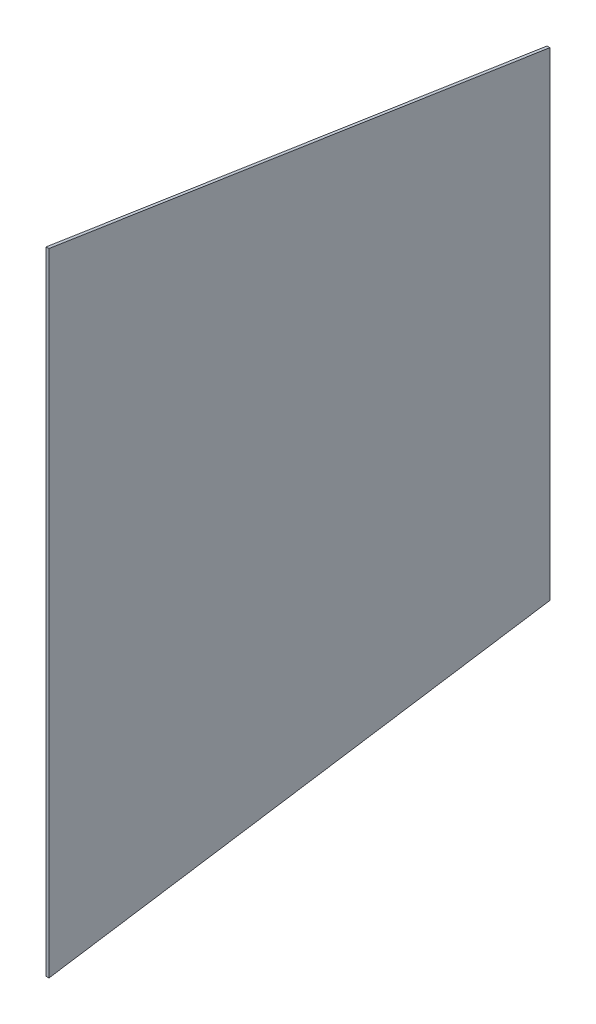
ISO-10303-21;
HEADER;
FILE_DESCRIPTION(('STEP AP214'),'2;1');
FILE_NAME('part.step','',(''),(''),'','','');
FILE_SCHEMA(('AUTOMOTIVE_DESIGN { 1 0 10303 214 1 1 1 1 }'));
ENDSEC;
DATA;
#1=APPLICATION_CONTEXT('core data for automotive mechanical design processes');
#2=APPLICATION_PROTOCOL_DEFINITION('international standard','automotive_design',2000,#1);
#3=PRODUCT_CONTEXT('',#1,'mechanical');
#4=PRODUCT('Part','Part','',(#3));
#5=PRODUCT_RELATED_PRODUCT_CATEGORY('part','',(#4));
#6=PRODUCT_DEFINITION_FORMATION('','',#4);
#7=PRODUCT_DEFINITION_CONTEXT('part definition',#1,'design');
#8=PRODUCT_DEFINITION('design','',#6,#7);
#9=PRODUCT_DEFINITION_SHAPE('','',#8);
#10=(LENGTH_UNIT() NAMED_UNIT(*) SI_UNIT(.MILLI.,.METRE.));
#11=(NAMED_UNIT(*) PLANE_ANGLE_UNIT() SI_UNIT($,.RADIAN.));
#12=(NAMED_UNIT(*) SI_UNIT($,.STERADIAN.) SOLID_ANGLE_UNIT());
#13=UNCERTAINTY_MEASURE_WITH_UNIT(LENGTH_MEASURE(1.E-05),#10,'distance_accuracy_value','');
#14=(GEOMETRIC_REPRESENTATION_CONTEXT(3) GLOBAL_UNCERTAINTY_ASSIGNED_CONTEXT((#13)) GLOBAL_UNIT_ASSIGNED_CONTEXT((#10,
#11,#12)) REPRESENTATION_CONTEXT('',''));
#15=CARTESIAN_POINT('',(0.,0.,0.));
#16=DIRECTION('',(0.,0.,1.));
#17=DIRECTION('',(1.,0.,0.));
#18=AXIS2_PLACEMENT_3D('',#15,#16,#17);
#19=CARTESIAN_POINT('',(15.875,131.986549459237,-442.9125));
#20=DIRECTION('',(0.,-0.988537017775799,0.150978688850212));
#21=DIRECTION('',(0.,-0.150978688850212,-0.988537017775799));
#22=AXIS2_PLACEMENT_3D('',#19,#20,#21);
#23=PLANE('',#22);
#24=DIRECTION('',(0.,0.150978688850212,0.988537017775799));
#25=VECTOR('',#24,1.);
#26=CARTESIAN_POINT('',(14.2875,131.986549459237,-442.9125));
#27=LINE('',#26,#25);
#28=CARTESIAN_POINT('',(14.2875,131.986549459237,-442.9125));
#29=VERTEX_POINT('',#28);
#30=CARTESIAN_POINT('',(14.2875,174.174234470248,-166.6875));
#31=VERTEX_POINT('',#30);
#32=EDGE_CURVE('E98',#29,#31,#27,.T.);
#33=ORIENTED_EDGE('',*,*,#32,.T.);
#34=DIRECTION('',(-1.,0.,0.));
#35=VECTOR('',#34,1.);
#36=CARTESIAN_POINT('',(15.875,174.174234470248,-166.6875));
#37=LINE('',#36,#35);
#38=CARTESIAN_POINT('',(15.875,174.174234470248,-166.6875));
#39=VERTEX_POINT('',#38);
#40=EDGE_CURVE('E11',#39,#31,#37,.T.);
#41=ORIENTED_EDGE('',*,*,#40,.F.);
#42=DIRECTION('',(0.,0.150978688850212,0.988537017775799));
#43=VECTOR('',#42,1.);
#44=CARTESIAN_POINT('',(15.875,131.986549459237,-442.9125));
#45=LINE('',#44,#43);
#46=CARTESIAN_POINT('',(15.875,131.986549459237,-442.9125));
#47=VERTEX_POINT('',#46);
#48=EDGE_CURVE('E86',#47,#39,#45,.T.);
#49=ORIENTED_EDGE('',*,*,#48,.F.);
#50=DIRECTION('',(-1.,0.,0.));
#51=VECTOR('',#50,1.);
#52=CARTESIAN_POINT('',(15.875,131.986549459237,-442.9125));
#53=LINE('',#52,#51);
#54=EDGE_CURVE('E94',#47,#29,#53,.T.);
#55=ORIENTED_EDGE('',*,*,#54,.T.);
#56=EDGE_LOOP('',(#33,#41,#49,#55));
#57=FACE_BOUND('',#56,.T.);
#58=ADVANCED_FACE('F35',(#57),#23,.F.);
#59=CARTESIAN_POINT('',(15.875,174.174234470248,-166.6875));
#60=DIRECTION('',(0.,0.,-1.));
#61=DIRECTION('',(-1.,0.,0.));
#62=AXIS2_PLACEMENT_3D('',#59,#60,#61);
#63=PLANE('',#62);
#64=DIRECTION('',(0.,-1.,0.));
#65=VECTOR('',#64,1.);
#66=CARTESIAN_POINT('',(14.2875,174.174234470248,-166.6875));
#67=LINE('',#66,#65);
#68=CARTESIAN_POINT('',(14.2875,-174.174234470248,-166.6875));
#69=VERTEX_POINT('',#68);
#70=EDGE_CURVE('E90',#31,#69,#67,.T.);
#71=ORIENTED_EDGE('',*,*,#70,.T.);
#72=DIRECTION('',(-1.,0.,0.));
#73=VECTOR('',#72,1.);
#74=CARTESIAN_POINT('',(15.875,-174.174234470248,-166.6875));
#75=LINE('',#74,#73);
#76=CARTESIAN_POINT('',(15.875,-174.174234470248,-166.6875));
#77=VERTEX_POINT('',#76);
#78=EDGE_CURVE('E43',#77,#69,#75,.T.);
#79=ORIENTED_EDGE('',*,*,#78,.F.);
#80=DIRECTION('',(0.,-1.,0.));
#81=VECTOR('',#80,1.);
#82=CARTESIAN_POINT('',(15.875,174.174234470248,-166.6875));
#83=LINE('',#82,#81);
#84=EDGE_CURVE('E81',#39,#77,#83,.T.);
#85=ORIENTED_EDGE('',*,*,#84,.F.);
#86=ORIENTED_EDGE('',*,*,#40,.T.);
#87=EDGE_LOOP('',(#71,#79,#85,#86));
#88=FACE_BOUND('',#87,.T.);
#89=ADVANCED_FACE('F89',(#88),#63,.F.);
#90=CARTESIAN_POINT('',(15.875,-174.174234470248,-166.6875));
#91=DIRECTION('',(0.,0.988537017775799,0.150978688850212));
#92=DIRECTION('',(0.,-0.150978688850212,0.988537017775799));
#93=AXIS2_PLACEMENT_3D('',#90,#91,#92);
#94=PLANE('',#93);
#95=DIRECTION('',(0.,0.150978688850212,-0.988537017775799));
#96=VECTOR('',#95,1.);
#97=CARTESIAN_POINT('',(14.2875,-174.174234470248,-166.6875));
#98=LINE('',#97,#96);
#99=CARTESIAN_POINT('',(14.2875,-131.986549459237,-442.9125));
#100=VERTEX_POINT('',#99);
#101=EDGE_CURVE('E68',#69,#100,#98,.T.);
#102=ORIENTED_EDGE('',*,*,#101,.T.);
#103=DIRECTION('',(-1.,0.,0.));
#104=VECTOR('',#103,1.);
#105=CARTESIAN_POINT('',(15.875,-131.986549459237,-442.9125));
#106=LINE('',#105,#104);
#107=CARTESIAN_POINT('',(15.875,-131.986549459237,-442.9125));
#108=VERTEX_POINT('',#107);
#109=EDGE_CURVE('E91',#108,#100,#106,.T.);
#110=ORIENTED_EDGE('',*,*,#109,.F.);
#111=DIRECTION('',(0.,0.150978688850212,-0.988537017775799));
#112=VECTOR('',#111,1.);
#113=CARTESIAN_POINT('',(15.875,-174.174234470248,-166.6875));
#114=LINE('',#113,#112);
#115=EDGE_CURVE('E84',#77,#108,#114,.T.);
#116=ORIENTED_EDGE('',*,*,#115,.F.);
#117=ORIENTED_EDGE('',*,*,#78,.T.);
#118=EDGE_LOOP('',(#102,#110,#116,#117));
#119=FACE_BOUND('',#118,.T.);
#120=ADVANCED_FACE('F92',(#119),#94,.F.);
#121=CARTESIAN_POINT('',(15.875,-131.986549459237,-442.9125));
#122=DIRECTION('',(0.,0.,1.));
#123=DIRECTION('',(1.,0.,0.));
#124=AXIS2_PLACEMENT_3D('',#121,#122,#123);
#125=PLANE('',#124);
#126=DIRECTION('',(0.,1.,0.));
#127=VECTOR('',#126,1.);
#128=CARTESIAN_POINT('',(14.2875,-131.986549459237,-442.9125));
#129=LINE('',#128,#127);
#130=EDGE_CURVE('E74',#100,#29,#129,.T.);
#131=ORIENTED_EDGE('',*,*,#130,.T.);
#132=ORIENTED_EDGE('',*,*,#54,.F.);
#133=DIRECTION('',(0.,1.,0.));
#134=VECTOR('',#133,1.);
#135=CARTESIAN_POINT('',(15.875,-131.986549459237,-442.9125));
#136=LINE('',#135,#134);
#137=EDGE_CURVE('E51',#108,#47,#136,.T.);
#138=ORIENTED_EDGE('',*,*,#137,.F.);
#139=ORIENTED_EDGE('',*,*,#109,.T.);
#140=EDGE_LOOP('',(#131,#132,#138,#139));
#141=FACE_BOUND('',#140,.T.);
#142=ADVANCED_FACE('F105',(#141),#125,.F.);
#143=CARTESIAN_POINT('',(15.875,0.,0.));
#144=DIRECTION('',(1.,0.,0.));
#145=DIRECTION('',(0.,0.,-1.));
#146=AXIS2_PLACEMENT_3D('',#143,#144,#145);
#147=PLANE('',#146);
#148=ORIENTED_EDGE('',*,*,#48,.T.);
#149=ORIENTED_EDGE('',*,*,#84,.T.);
#150=ORIENTED_EDGE('',*,*,#115,.T.);
#151=ORIENTED_EDGE('',*,*,#137,.T.);
#152=EDGE_LOOP('',(#148,#149,#150,#151));
#153=FACE_BOUND('',#152,.T.);
#154=ADVANCED_FACE('F82',(#153),#147,.T.);
#155=CARTESIAN_POINT('',(14.2875,0.,0.));
#156=DIRECTION('',(1.,0.,0.));
#157=DIRECTION('',(0.,0.,-1.));
#158=AXIS2_PLACEMENT_3D('',#155,#156,#157);
#159=PLANE('',#158);
#160=ORIENTED_EDGE('',*,*,#32,.F.);
#161=ORIENTED_EDGE('',*,*,#130,.F.);
#162=ORIENTED_EDGE('',*,*,#101,.F.);
#163=ORIENTED_EDGE('',*,*,#70,.F.);
#164=EDGE_LOOP('',(#160,#161,#162,#163));
#165=FACE_BOUND('',#164,.T.);
#166=ADVANCED_FACE('F108',(#165),#159,.F.);
#167=CLOSED_SHELL('',(#58,#89,#120,#142,#154,#166));
#168=MANIFOLD_SOLID_BREP('B2',#167);
#169=ADVANCED_BREP_SHAPE_REPRESENTATION('',(#18,#168),#14);
#170=SHAPE_DEFINITION_REPRESENTATION(#9,#169);
ENDSEC;
END-ISO-10303-21;
